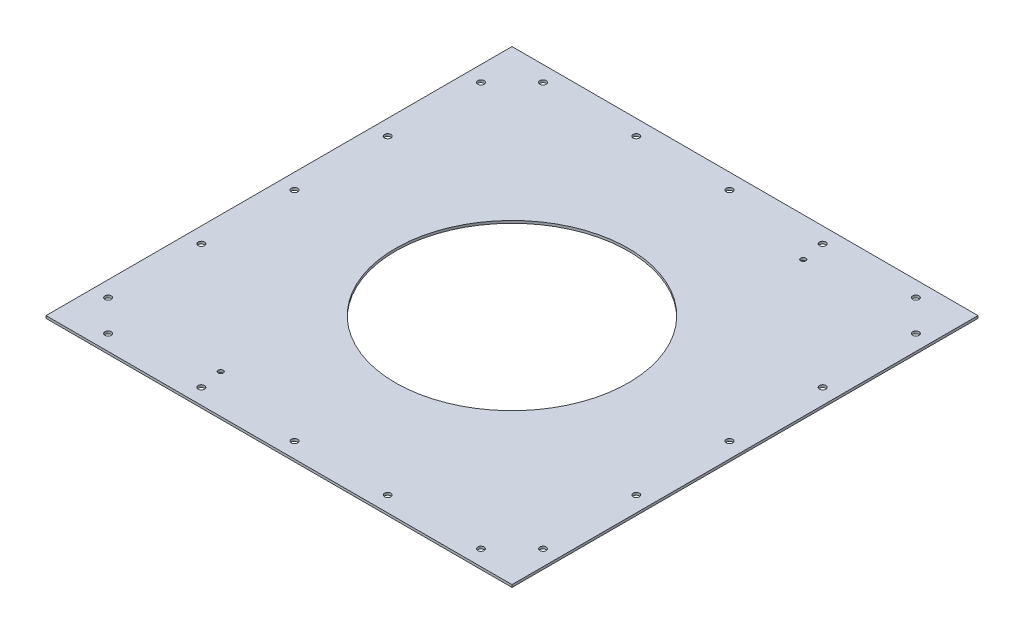
ISO-10303-21;
HEADER;
FILE_DESCRIPTION(('STEP AP214'),'2;1');
FILE_NAME('part.step','',(''),(''),'','','');
FILE_SCHEMA(('AUTOMOTIVE_DESIGN { 1 0 10303 214 1 1 1 1 }'));
ENDSEC;
DATA;
#1=APPLICATION_CONTEXT('core data for automotive mechanical design processes');
#2=APPLICATION_PROTOCOL_DEFINITION('international standard','automotive_design',2000,#1);
#3=PRODUCT_CONTEXT('',#1,'mechanical');
#4=PRODUCT('Part','Part','',(#3));
#5=PRODUCT_RELATED_PRODUCT_CATEGORY('part','',(#4));
#6=PRODUCT_DEFINITION_FORMATION('','',#4);
#7=PRODUCT_DEFINITION_CONTEXT('part definition',#1,'design');
#8=PRODUCT_DEFINITION('design','',#6,#7);
#9=PRODUCT_DEFINITION_SHAPE('','',#8);
#10=(LENGTH_UNIT() NAMED_UNIT(*) SI_UNIT(.MILLI.,.METRE.));
#11=(NAMED_UNIT(*) PLANE_ANGLE_UNIT() SI_UNIT($,.RADIAN.));
#12=(NAMED_UNIT(*) SI_UNIT($,.STERADIAN.) SOLID_ANGLE_UNIT());
#13=UNCERTAINTY_MEASURE_WITH_UNIT(LENGTH_MEASURE(1.E-05),#10,'distance_accuracy_value','');
#14=(GEOMETRIC_REPRESENTATION_CONTEXT(3) GLOBAL_UNCERTAINTY_ASSIGNED_CONTEXT((#13)) GLOBAL_UNIT_ASSIGNED_CONTEXT((#10,
#11,#12)) REPRESENTATION_CONTEXT('',''));
#15=CARTESIAN_POINT('',(0.,0.,0.));
#16=DIRECTION('',(0.,0.,1.));
#17=DIRECTION('',(1.,0.,0.));
#18=AXIS2_PLACEMENT_3D('',#15,#16,#17);
#19=CARTESIAN_POINT('',(300.000000000012,-1.5875,300.));
#20=DIRECTION('',(1.,0.,0.));
#21=DIRECTION('',(0.,0.,-1.));
#22=AXIS2_PLACEMENT_3D('',#19,#20,#21);
#23=PLANE('',#22);
#24=DIRECTION('',(0.,1.,0.));
#25=VECTOR('',#24,1.);
#26=CARTESIAN_POINT('',(300.000000000011,-1.5875,-300.));
#27=LINE('',#26,#25);
#28=CARTESIAN_POINT('',(300.000000000011,-1.5875,-300.));
#29=VERTEX_POINT('',#28);
#30=CARTESIAN_POINT('',(300.000000000011,1.5875,-300.));
#31=VERTEX_POINT('',#30);
#32=EDGE_CURVE('E35',#29,#31,#27,.T.);
#33=ORIENTED_EDGE('',*,*,#32,.T.);
#34=DIRECTION('',(0.,0.,-1.));
#35=VECTOR('',#34,1.);
#36=CARTESIAN_POINT('',(300.000000000012,1.5875,300.));
#37=LINE('',#36,#35);
#38=CARTESIAN_POINT('',(300.000000000012,1.5875,300.));
#39=VERTEX_POINT('',#38);
#40=EDGE_CURVE('E72',#39,#31,#37,.T.);
#41=ORIENTED_EDGE('',*,*,#40,.F.);
#42=DIRECTION('',(0.,1.,0.));
#43=VECTOR('',#42,1.);
#44=CARTESIAN_POINT('',(300.000000000012,-1.5875,300.));
#45=LINE('',#44,#43);
#46=CARTESIAN_POINT('',(300.000000000012,-1.5875,300.));
#47=VERTEX_POINT('',#46);
#48=EDGE_CURVE('E11',#47,#39,#45,.T.);
#49=ORIENTED_EDGE('',*,*,#48,.F.);
#50=DIRECTION('',(0.,0.,-1.));
#51=VECTOR('',#50,1.);
#52=CARTESIAN_POINT('',(300.000000000012,-1.5875,300.));
#53=LINE('',#52,#51);
#54=EDGE_CURVE('E73',#47,#29,#53,.T.);
#55=ORIENTED_EDGE('',*,*,#54,.T.);
#56=EDGE_LOOP('',(#33,#41,#49,#55));
#57=FACE_BOUND('',#56,.T.);
#58=ADVANCED_FACE('F32',(#57),#23,.T.);
#59=CARTESIAN_POINT('',(-300.000000000011,-1.5875,300.));
#60=DIRECTION('',(0.,0.,1.));
#61=DIRECTION('',(1.,0.,0.));
#62=AXIS2_PLACEMENT_3D('',#59,#60,#61);
#63=PLANE('',#62);
#64=ORIENTED_EDGE('',*,*,#48,.T.);
#65=DIRECTION('',(1.,0.,0.));
#66=VECTOR('',#65,1.);
#67=CARTESIAN_POINT('',(-300.000000000011,1.5875,300.));
#68=LINE('',#67,#66);
#69=CARTESIAN_POINT('',(-300.000000000011,1.5875,300.));
#70=VERTEX_POINT('',#69);
#71=EDGE_CURVE('E90',#70,#39,#68,.T.);
#72=ORIENTED_EDGE('',*,*,#71,.F.);
#73=DIRECTION('',(0.,1.,0.));
#74=VECTOR('',#73,1.);
#75=CARTESIAN_POINT('',(-300.000000000011,-1.5875,300.));
#76=LINE('',#75,#74);
#77=CARTESIAN_POINT('',(-300.000000000011,-1.5875,300.));
#78=VERTEX_POINT('',#77);
#79=EDGE_CURVE('E40',#78,#70,#76,.T.);
#80=ORIENTED_EDGE('',*,*,#79,.F.);
#81=DIRECTION('',(1.,0.,0.));
#82=VECTOR('',#81,1.);
#83=CARTESIAN_POINT('',(-300.000000000011,-1.5875,300.));
#84=LINE('',#83,#82);
#85=EDGE_CURVE('E78',#78,#47,#84,.T.);
#86=ORIENTED_EDGE('',*,*,#85,.T.);
#87=EDGE_LOOP('',(#64,#72,#80,#86));
#88=FACE_BOUND('',#87,.T.);
#89=ADVANCED_FACE('F119',(#88),#63,.T.);
#90=CARTESIAN_POINT('',(-300.000000000011,-1.5875,300.));
#91=DIRECTION('',(-1.,0.,0.));
#92=DIRECTION('',(0.,0.,1.));
#93=AXIS2_PLACEMENT_3D('',#90,#91,#92);
#94=PLANE('',#93);
#95=ORIENTED_EDGE('',*,*,#79,.T.);
#96=DIRECTION('',(0.,0.,1.));
#97=VECTOR('',#96,1.);
#98=CARTESIAN_POINT('',(-300.000000000011,1.5875,300.));
#99=LINE('',#98,#97);
#100=CARTESIAN_POINT('',(-300.000000000011,1.5875,-300.));
#101=VERTEX_POINT('',#100);
#102=EDGE_CURVE('E85',#101,#70,#99,.T.);
#103=ORIENTED_EDGE('',*,*,#102,.F.);
#104=DIRECTION('',(0.,1.,0.));
#105=VECTOR('',#104,1.);
#106=CARTESIAN_POINT('',(-300.000000000011,-1.5875,-300.));
#107=LINE('',#106,#105);
#108=CARTESIAN_POINT('',(-300.000000000011,-1.5875,-300.));
#109=VERTEX_POINT('',#108);
#110=EDGE_CURVE('E77',#109,#101,#107,.T.);
#111=ORIENTED_EDGE('',*,*,#110,.F.);
#112=DIRECTION('',(0.,0.,1.));
#113=VECTOR('',#112,1.);
#114=CARTESIAN_POINT('',(-300.000000000011,-1.5875,300.));
#115=LINE('',#114,#113);
#116=EDGE_CURVE('E112',#109,#78,#115,.T.);
#117=ORIENTED_EDGE('',*,*,#116,.T.);
#118=EDGE_LOOP('',(#95,#103,#111,#117));
#119=FACE_BOUND('',#118,.T.);
#120=ADVANCED_FACE('F116',(#119),#94,.T.);
#121=CARTESIAN_POINT('',(-300.000000000011,-1.5875,-300.));
#122=DIRECTION('',(0.,0.,-1.));
#123=DIRECTION('',(-1.,0.,0.));
#124=AXIS2_PLACEMENT_3D('',#121,#122,#123);
#125=PLANE('',#124);
#126=ORIENTED_EDGE('',*,*,#110,.T.);
#127=DIRECTION('',(-1.,0.,0.));
#128=VECTOR('',#127,1.);
#129=CARTESIAN_POINT('',(-300.000000000011,1.5875,-300.));
#130=LINE('',#129,#128);
#131=EDGE_CURVE('E80',#31,#101,#130,.T.);
#132=ORIENTED_EDGE('',*,*,#131,.F.);
#133=ORIENTED_EDGE('',*,*,#32,.F.);
#134=DIRECTION('',(-1.,0.,0.));
#135=VECTOR('',#134,1.);
#136=CARTESIAN_POINT('',(-300.000000000011,-1.5875,-300.));
#137=LINE('',#136,#135);
#138=EDGE_CURVE('E110',#29,#109,#137,.T.);
#139=ORIENTED_EDGE('',*,*,#138,.T.);
#140=EDGE_LOOP('',(#126,#132,#133,#139));
#141=FACE_BOUND('',#140,.T.);
#142=ADVANCED_FACE('F81',(#141),#125,.T.);
#143=CARTESIAN_POINT('',(0.,-1.5875,0.));
#144=DIRECTION('',(0.,-1.,0.));
#145=DIRECTION('',(0.,0.,-1.));
#146=AXIS2_PLACEMENT_3D('',#143,#144,#145);
#147=PLANE('',#146);
#148=CARTESIAN_POINT('',(280.,-1.5875,-119.999999999999));
#149=DIRECTION('',(0.,1.,0.));
#150=DIRECTION('',(-1.,0.,0.));
#151=AXIS2_PLACEMENT_3D('',#148,#149,#150);
#152=CIRCLE('',#151,4.1);
#153=CARTESIAN_POINT('',(275.9,-1.5875,-119.999999999999));
#154=VERTEX_POINT('',#153);
#155=EDGE_CURVE('E394',#154,#154,#152,.T.);
#156=ORIENTED_EDGE('',*,*,#155,.T.);
#157=EDGE_LOOP('',(#156));
#158=FACE_BOUND('',#157,.T.);
#159=CARTESIAN_POINT('',(279.999999999999,-1.5875,-239.999999999999));
#160=DIRECTION('',(0.,1.,0.));
#161=DIRECTION('',(-1.,0.,0.));
#162=AXIS2_PLACEMENT_3D('',#159,#160,#161);
#163=CIRCLE('',#162,4.10000000000001);
#164=CARTESIAN_POINT('',(275.899999999999,-1.5875,-239.999999999999));
#165=VERTEX_POINT('',#164);
#166=EDGE_CURVE('E398',#165,#165,#163,.T.);
#167=ORIENTED_EDGE('',*,*,#166,.T.);
#168=EDGE_LOOP('',(#167));
#169=FACE_BOUND('',#168,.T.);
#170=CARTESIAN_POINT('',(279.999999999998,-1.5875,240.000000000001));
#171=DIRECTION('',(0.,1.,0.));
#172=DIRECTION('',(1.,0.,0.));
#173=AXIS2_PLACEMENT_3D('',#170,#171,#172);
#174=CIRCLE('',#173,4.10000000000001);
#175=CARTESIAN_POINT('',(284.099999999998,-1.5875,240.000000000001));
#176=VERTEX_POINT('',#175);
#177=EDGE_CURVE('E410',#176,#176,#174,.T.);
#178=ORIENTED_EDGE('',*,*,#177,.T.);
#179=EDGE_LOOP('',(#178));
#180=FACE_BOUND('',#179,.T.);
#181=CARTESIAN_POINT('',(279.999999999999,-1.5875,120.000000000001));
#182=DIRECTION('',(0.,1.,0.));
#183=DIRECTION('',(1.,0.,0.));
#184=AXIS2_PLACEMENT_3D('',#181,#182,#183);
#185=CIRCLE('',#184,4.1);
#186=CARTESIAN_POINT('',(284.099999999999,-1.5875,120.000000000001));
#187=VERTEX_POINT('',#186);
#188=EDGE_CURVE('E415',#187,#187,#185,.T.);
#189=ORIENTED_EDGE('',*,*,#188,.T.);
#190=EDGE_LOOP('',(#189));
#191=FACE_BOUND('',#190,.T.);
#192=CARTESIAN_POINT('',(-240.,-1.5875,279.999999999998));
#193=DIRECTION('',(0.,1.,0.));
#194=DIRECTION('',(0.,0.,1.));
#195=AXIS2_PLACEMENT_3D('',#192,#193,#194);
#196=CIRCLE('',#195,4.10000000000001);
#197=CARTESIAN_POINT('',(-240.,-1.5875,284.099999999998));
#198=VERTEX_POINT('',#197);
#199=EDGE_CURVE('E428',#198,#198,#196,.T.);
#200=ORIENTED_EDGE('',*,*,#199,.T.);
#201=EDGE_LOOP('',(#200));
#202=FACE_BOUND('',#201,.T.);
#203=CARTESIAN_POINT('',(240.,-1.5875,279.999999999998));
#204=DIRECTION('',(0.,1.,0.));
#205=DIRECTION('',(0.,0.,-1.));
#206=AXIS2_PLACEMENT_3D('',#203,#204,#205);
#207=CIRCLE('',#206,4.10000000000001);
#208=CARTESIAN_POINT('',(240.,-1.5875,275.899999999998));
#209=VERTEX_POINT('',#208);
#210=EDGE_CURVE('E427',#209,#209,#207,.T.);
#211=ORIENTED_EDGE('',*,*,#210,.T.);
#212=EDGE_LOOP('',(#211));
#213=FACE_BOUND('',#212,.T.);
#214=CARTESIAN_POINT('',(120.,-1.5875,279.999999999999));
#215=DIRECTION('',(0.,1.,0.));
#216=DIRECTION('',(0.,0.,-1.));
#217=AXIS2_PLACEMENT_3D('',#214,#215,#216);
#218=CIRCLE('',#217,4.1);
#219=CARTESIAN_POINT('',(120.,-1.5875,275.899999999999));
#220=VERTEX_POINT('',#219);
#221=EDGE_CURVE('E441',#220,#220,#218,.T.);
#222=ORIENTED_EDGE('',*,*,#221,.T.);
#223=EDGE_LOOP('',(#222));
#224=FACE_BOUND('',#223,.T.);
#225=CARTESIAN_POINT('',(0.,-1.5875,280.));
#226=DIRECTION('',(0.,1.,0.));
#227=DIRECTION('',(0.,0.,-1.));
#228=AXIS2_PLACEMENT_3D('',#225,#226,#227);
#229=CIRCLE('',#228,4.1);
#230=CARTESIAN_POINT('',(0.,-1.5875,275.9));
#231=VERTEX_POINT('',#230);
#232=EDGE_CURVE('E421',#231,#231,#229,.T.);
#233=ORIENTED_EDGE('',*,*,#232,.T.);
#234=EDGE_LOOP('',(#233));
#235=FACE_BOUND('',#234,.T.);
#236=CARTESIAN_POINT('',(-280.000000000001,-1.5875,239.999999999997));
#237=DIRECTION('',(0.,1.,0.));
#238=DIRECTION('',(1.,0.,0.));
#239=AXIS2_PLACEMENT_3D('',#236,#237,#238);
#240=CIRCLE('',#239,4.10000000000001);
#241=CARTESIAN_POINT('',(-275.900000000001,-1.5875,239.999999999997));
#242=VERTEX_POINT('',#241);
#243=EDGE_CURVE('E577',#242,#242,#240,.T.);
#244=ORIENTED_EDGE('',*,*,#243,.T.);
#245=EDGE_LOOP('',(#244));
#246=FACE_BOUND('',#245,.T.);
#247=CARTESIAN_POINT('',(-280.,-1.5875,119.999999999997));
#248=DIRECTION('',(0.,1.,0.));
#249=DIRECTION('',(1.,0.,0.));
#250=AXIS2_PLACEMENT_3D('',#247,#248,#249);
#251=CIRCLE('',#250,4.1);
#252=CARTESIAN_POINT('',(-275.9,-1.5875,119.999999999997));
#253=VERTEX_POINT('',#252);
#254=EDGE_CURVE('E573',#253,#253,#251,.T.);
#255=ORIENTED_EDGE('',*,*,#254,.T.);
#256=EDGE_LOOP('',(#255));
#257=FACE_BOUND('',#256,.T.);
#258=CARTESIAN_POINT('',(-280.,-1.5875,-2.93529361822653E-12));
#259=DIRECTION('',(0.,1.,0.));
#260=DIRECTION('',(1.,0.,0.));
#261=AXIS2_PLACEMENT_3D('',#258,#259,#260);
#262=CIRCLE('',#261,4.1);
#263=CARTESIAN_POINT('',(-275.9,-1.5875,-2.89234839775876E-12));
#264=VERTEX_POINT('',#263);
#265=EDGE_CURVE('E569',#264,#264,#262,.T.);
#266=ORIENTED_EDGE('',*,*,#265,.T.);
#267=EDGE_LOOP('',(#266));
#268=FACE_BOUND('',#267,.T.);
#269=CARTESIAN_POINT('',(-120.,-1.5875,279.999999999999));
#270=DIRECTION('',(0.,1.,0.));
#271=DIRECTION('',(0.,0.,1.));
#272=AXIS2_PLACEMENT_3D('',#269,#270,#271);
#273=CIRCLE('',#272,4.1);
#274=CARTESIAN_POINT('',(-120.,-1.5875,284.099999999999));
#275=VERTEX_POINT('',#274);
#276=EDGE_CURVE('E435',#275,#275,#273,.T.);
#277=ORIENTED_EDGE('',*,*,#276,.T.);
#278=EDGE_LOOP('',(#277));
#279=FACE_BOUND('',#278,.T.);
#280=CARTESIAN_POINT('',(-279.999999999996,-1.5875,-240.000000000003));
#281=DIRECTION('',(0.,1.,0.));
#282=DIRECTION('',(-1.,0.,0.));
#283=AXIS2_PLACEMENT_3D('',#280,#281,#282);
#284=CIRCLE('',#283,4.10000000000001);
#285=CARTESIAN_POINT('',(-284.099999999996,-1.5875,-240.000000000003));
#286=VERTEX_POINT('',#285);
#287=EDGE_CURVE('E565',#286,#286,#284,.T.);
#288=ORIENTED_EDGE('',*,*,#287,.T.);
#289=EDGE_LOOP('',(#288));
#290=FACE_BOUND('',#289,.T.);
#291=CARTESIAN_POINT('',(-279.999999999998,-1.5875,-120.000000000003));
#292=DIRECTION('',(0.,1.,0.));
#293=DIRECTION('',(-1.,0.,0.));
#294=AXIS2_PLACEMENT_3D('',#291,#292,#293);
#295=CIRCLE('',#294,4.1);
#296=CARTESIAN_POINT('',(-284.099999999998,-1.5875,-120.000000000003));
#297=VERTEX_POINT('',#296);
#298=EDGE_CURVE('E406',#297,#297,#295,.T.);
#299=ORIENTED_EDGE('',*,*,#298,.T.);
#300=EDGE_LOOP('',(#299));
#301=FACE_BOUND('',#300,.T.);
#302=CARTESIAN_POINT('',(280.,-1.5875,9.80064068474372E-13));
#303=DIRECTION('',(0.,1.,0.));
#304=DIRECTION('',(-1.,0.,0.));
#305=AXIS2_PLACEMENT_3D('',#302,#303,#304);
#306=CIRCLE('',#305,4.1);
#307=CARTESIAN_POINT('',(275.9,-1.5875,9.65748994985115E-13));
#308=VERTEX_POINT('',#307);
#309=EDGE_CURVE('E450',#308,#308,#306,.T.);
#310=ORIENTED_EDGE('',*,*,#309,.T.);
#311=EDGE_LOOP('',(#310));
#312=FACE_BOUND('',#311,.T.);
#313=CARTESIAN_POINT('',(120.,-1.5875,-279.999999999999));
#314=DIRECTION('',(0.,1.,0.));
#315=DIRECTION('',(0.,0.,-1.));
#316=AXIS2_PLACEMENT_3D('',#313,#314,#315);
#317=CIRCLE('',#316,4.1);
#318=CARTESIAN_POINT('',(120.,-1.5875,-284.099999999999));
#319=VERTEX_POINT('',#318);
#320=EDGE_CURVE('E471',#319,#319,#317,.T.);
#321=ORIENTED_EDGE('',*,*,#320,.T.);
#322=EDGE_LOOP('',(#321));
#323=FACE_BOUND('',#322,.T.);
#324=CARTESIAN_POINT('',(240.,-1.5875,-279.999999999998));
#325=DIRECTION('',(0.,1.,0.));
#326=DIRECTION('',(0.,0.,-1.));
#327=AXIS2_PLACEMENT_3D('',#324,#325,#326);
#328=CIRCLE('',#327,4.10000000000001);
#329=CARTESIAN_POINT('',(240.,-1.5875,-284.099999999998));
#330=VERTEX_POINT('',#329);
#331=EDGE_CURVE('E465',#330,#330,#328,.T.);
#332=ORIENTED_EDGE('',*,*,#331,.T.);
#333=EDGE_LOOP('',(#332));
#334=FACE_BOUND('',#333,.T.);
#335=CARTESIAN_POINT('',(-240.,-1.5875,-279.999999999998));
#336=DIRECTION('',(0.,1.,0.));
#337=DIRECTION('',(0.,0.,1.));
#338=AXIS2_PLACEMENT_3D('',#335,#336,#337);
#339=CIRCLE('',#338,4.10000000000001);
#340=CARTESIAN_POINT('',(-240.,-1.5875,-275.899999999998));
#341=VERTEX_POINT('',#340);
#342=EDGE_CURVE('E458',#341,#341,#339,.T.);
#343=ORIENTED_EDGE('',*,*,#342,.T.);
#344=EDGE_LOOP('',(#343));
#345=FACE_BOUND('',#344,.T.);
#346=CARTESIAN_POINT('',(-120.,-1.5875,-279.999999999999));
#347=DIRECTION('',(0.,1.,0.));
#348=DIRECTION('',(0.,0.,1.));
#349=AXIS2_PLACEMENT_3D('',#346,#347,#348);
#350=CIRCLE('',#349,4.1);
#351=CARTESIAN_POINT('',(-120.,-1.5875,-275.899999999999));
#352=VERTEX_POINT('',#351);
#353=EDGE_CURVE('E457',#352,#352,#350,.T.);
#354=ORIENTED_EDGE('',*,*,#353,.T.);
#355=EDGE_LOOP('',(#354));
#356=FACE_BOUND('',#355,.T.);
#357=CARTESIAN_POINT('',(0.,-1.5875,-280.));
#358=DIRECTION('',(0.,1.,0.));
#359=DIRECTION('',(0.,0.,1.));
#360=AXIS2_PLACEMENT_3D('',#357,#358,#359);
#361=CIRCLE('',#360,4.1);
#362=CARTESIAN_POINT('',(0.,-1.5875,-275.9));
#363=VERTEX_POINT('',#362);
#364=EDGE_CURVE('E480',#363,#363,#361,.T.);
#365=ORIENTED_EDGE('',*,*,#364,.T.);
#366=EDGE_LOOP('',(#365));
#367=FACE_BOUND('',#366,.T.);
#368=CARTESIAN_POINT('',(-2.22044604925031E-13,-1.5875,1.11022302462516E-13));
#369=DIRECTION('',(0.,1.,0.));
#370=DIRECTION('',(0.,0.,1.));
#371=AXIS2_PLACEMENT_3D('',#368,#369,#370);
#372=CIRCLE('',#371,150.);
#373=CARTESIAN_POINT('',(-2.22044604925031E-13,-1.5875,150.));
#374=VERTEX_POINT('',#373);
#375=EDGE_CURVE('E100',#374,#374,#372,.T.);
#376=ORIENTED_EDGE('',*,*,#375,.T.);
#377=EDGE_LOOP('',(#376));
#378=FACE_BOUND('',#377,.T.);
#379=CARTESIAN_POINT('',(-124.999999999998,-1.5875,250.000000000001));
#380=DIRECTION('',(0.,1.,0.));
#381=DIRECTION('',(0.,0.,1.));
#382=AXIS2_PLACEMENT_3D('',#379,#380,#381);
#383=CIRCLE('',#382,3.25000000000001);
#384=CARTESIAN_POINT('',(-124.999999999998,-1.5875,253.250000000001));
#385=VERTEX_POINT('',#384);
#386=EDGE_CURVE('E103',#385,#385,#383,.T.);
#387=ORIENTED_EDGE('',*,*,#386,.T.);
#388=EDGE_LOOP('',(#387));
#389=FACE_BOUND('',#388,.T.);
#390=CARTESIAN_POINT('',(124.999999999998,-1.5875,-250.000000000001));
#391=DIRECTION('',(0.,1.,0.));
#392=DIRECTION('',(0.,0.,1.));
#393=AXIS2_PLACEMENT_3D('',#390,#391,#392);
#394=CIRCLE('',#393,3.25000000000001);
#395=CARTESIAN_POINT('',(124.999999999998,-1.5875,-246.750000000001));
#396=VERTEX_POINT('',#395);
#397=EDGE_CURVE('E106',#396,#396,#394,.T.);
#398=ORIENTED_EDGE('',*,*,#397,.T.);
#399=EDGE_LOOP('',(#398));
#400=FACE_BOUND('',#399,.T.);
#401=ORIENTED_EDGE('',*,*,#54,.F.);
#402=ORIENTED_EDGE('',*,*,#85,.F.);
#403=ORIENTED_EDGE('',*,*,#116,.F.);
#404=ORIENTED_EDGE('',*,*,#138,.F.);
#405=EDGE_LOOP('',(#401,#402,#403,#404));
#406=FACE_BOUND('',#405,.T.);
#407=ADVANCED_FACE('F121',(#158,#169,#180,#191,#202,#213,#224,#235,#246,#257,#268,#279,#290,
#301,#312,#323,#334,#345,#356,#367,#378,#389,#400,#406),#147,.T.);
#408=CARTESIAN_POINT('',(124.999999999998,-1.5875,-250.000000000001));
#409=DIRECTION('',(0.,1.,0.));
#410=DIRECTION('',(0.,0.,1.));
#411=AXIS2_PLACEMENT_3D('',#408,#409,#410);
#412=CYLINDRICAL_SURFACE('',#411,3.25000000000001);
#413=ORIENTED_EDGE('',*,*,#397,.F.);
#414=EDGE_LOOP('',(#413));
#415=FACE_BOUND('',#414,.T.);
#416=CARTESIAN_POINT('',(124.999999999998,1.5875,-250.000000000001));
#417=DIRECTION('',(0.,1.,0.));
#418=DIRECTION('',(0.,0.,1.));
#419=AXIS2_PLACEMENT_3D('',#416,#417,#418);
#420=CIRCLE('',#419,3.25000000000001);
#421=CARTESIAN_POINT('',(124.999999999998,1.5875,-246.750000000001));
#422=VERTEX_POINT('',#421);
#423=EDGE_CURVE('E91',#422,#422,#420,.T.);
#424=ORIENTED_EDGE('',*,*,#423,.T.);
#425=EDGE_LOOP('',(#424));
#426=FACE_BOUND('',#425,.T.);
#427=ADVANCED_FACE('F123',(#415,#426),#412,.F.);
#428=CARTESIAN_POINT('',(-124.999999999998,-1.5875,250.000000000001));
#429=DIRECTION('',(0.,1.,0.));
#430=DIRECTION('',(0.,0.,1.));
#431=AXIS2_PLACEMENT_3D('',#428,#429,#430);
#432=CYLINDRICAL_SURFACE('',#431,3.25000000000001);
#433=ORIENTED_EDGE('',*,*,#386,.F.);
#434=EDGE_LOOP('',(#433));
#435=FACE_BOUND('',#434,.T.);
#436=CARTESIAN_POINT('',(-124.999999999998,1.5875,250.000000000001));
#437=DIRECTION('',(0.,1.,0.));
#438=DIRECTION('',(0.,0.,1.));
#439=AXIS2_PLACEMENT_3D('',#436,#437,#438);
#440=CIRCLE('',#439,3.25000000000001);
#441=CARTESIAN_POINT('',(-124.999999999998,1.5875,253.250000000001));
#442=VERTEX_POINT('',#441);
#443=EDGE_CURVE('E94',#442,#442,#440,.T.);
#444=ORIENTED_EDGE('',*,*,#443,.T.);
#445=EDGE_LOOP('',(#444));
#446=FACE_BOUND('',#445,.T.);
#447=ADVANCED_FACE('F130',(#435,#446),#432,.F.);
#448=CARTESIAN_POINT('',(-2.22044604925031E-13,-1.5875,1.11022302462516E-13));
#449=DIRECTION('',(0.,1.,0.));
#450=DIRECTION('',(0.,0.,1.));
#451=AXIS2_PLACEMENT_3D('',#448,#449,#450);
#452=CYLINDRICAL_SURFACE('',#451,150.);
#453=ORIENTED_EDGE('',*,*,#375,.F.);
#454=EDGE_LOOP('',(#453));
#455=FACE_BOUND('',#454,.T.);
#456=CARTESIAN_POINT('',(-2.22044604925031E-13,1.5875,1.11022302462516E-13));
#457=DIRECTION('',(0.,1.,0.));
#458=DIRECTION('',(0.,0.,1.));
#459=AXIS2_PLACEMENT_3D('',#456,#457,#458);
#460=CIRCLE('',#459,150.);
#461=CARTESIAN_POINT('',(-2.22044604925031E-13,1.5875,150.));
#462=VERTEX_POINT('',#461);
#463=EDGE_CURVE('E483',#462,#462,#460,.T.);
#464=ORIENTED_EDGE('',*,*,#463,.T.);
#465=EDGE_LOOP('',(#464));
#466=FACE_BOUND('',#465,.T.);
#467=ADVANCED_FACE('F166',(#455,#466),#452,.F.);
#468=CARTESIAN_POINT('',(0.,1.5875,0.));
#469=DIRECTION('',(0.,-1.,0.));
#470=DIRECTION('',(0.,0.,-1.));
#471=AXIS2_PLACEMENT_3D('',#468,#469,#470);
#472=PLANE('',#471);
#473=CARTESIAN_POINT('',(280.,1.5875,-119.999999999999));
#474=DIRECTION('',(0.,1.,0.));
#475=DIRECTION('',(-1.,0.,0.));
#476=AXIS2_PLACEMENT_3D('',#473,#474,#475);
#477=CIRCLE('',#476,4.1);
#478=CARTESIAN_POINT('',(275.9,1.5875,-119.999999999999));
#479=VERTEX_POINT('',#478);
#480=EDGE_CURVE('E397',#479,#479,#477,.T.);
#481=ORIENTED_EDGE('',*,*,#480,.F.);
#482=EDGE_LOOP('',(#481));
#483=FACE_BOUND('',#482,.T.);
#484=CARTESIAN_POINT('',(279.999999999999,1.5875,-239.999999999999));
#485=DIRECTION('',(0.,1.,0.));
#486=DIRECTION('',(-1.,0.,0.));
#487=AXIS2_PLACEMENT_3D('',#484,#485,#486);
#488=CIRCLE('',#487,4.10000000000001);
#489=CARTESIAN_POINT('',(275.899999999999,1.5875,-239.999999999999));
#490=VERTEX_POINT('',#489);
#491=EDGE_CURVE('E403',#490,#490,#488,.T.);
#492=ORIENTED_EDGE('',*,*,#491,.F.);
#493=EDGE_LOOP('',(#492));
#494=FACE_BOUND('',#493,.T.);
#495=CARTESIAN_POINT('',(279.999999999998,1.5875,240.000000000001));
#496=DIRECTION('',(0.,1.,0.));
#497=DIRECTION('',(1.,0.,0.));
#498=AXIS2_PLACEMENT_3D('',#495,#496,#497);
#499=CIRCLE('',#498,4.10000000000001);
#500=CARTESIAN_POINT('',(284.099999999998,1.5875,240.000000000001));
#501=VERTEX_POINT('',#500);
#502=EDGE_CURVE('E412',#501,#501,#499,.T.);
#503=ORIENTED_EDGE('',*,*,#502,.F.);
#504=EDGE_LOOP('',(#503));
#505=FACE_BOUND('',#504,.T.);
#506=CARTESIAN_POINT('',(279.999999999999,1.5875,120.000000000001));
#507=DIRECTION('',(0.,1.,0.));
#508=DIRECTION('',(1.,0.,0.));
#509=AXIS2_PLACEMENT_3D('',#506,#507,#508);
#510=CIRCLE('',#509,4.1);
#511=CARTESIAN_POINT('',(284.099999999999,1.5875,120.000000000001));
#512=VERTEX_POINT('',#511);
#513=EDGE_CURVE('E418',#512,#512,#510,.T.);
#514=ORIENTED_EDGE('',*,*,#513,.F.);
#515=EDGE_LOOP('',(#514));
#516=FACE_BOUND('',#515,.T.);
#517=CARTESIAN_POINT('',(-240.,1.5875,279.999999999998));
#518=DIRECTION('',(0.,1.,0.));
#519=DIRECTION('',(0.,0.,1.));
#520=AXIS2_PLACEMENT_3D('',#517,#518,#519);
#521=CIRCLE('',#520,4.10000000000001);
#522=CARTESIAN_POINT('',(-240.,1.5875,284.099999999998));
#523=VERTEX_POINT('',#522);
#524=EDGE_CURVE('E432',#523,#523,#521,.T.);
#525=ORIENTED_EDGE('',*,*,#524,.F.);
#526=EDGE_LOOP('',(#525));
#527=FACE_BOUND('',#526,.T.);
#528=CARTESIAN_POINT('',(240.,1.5875,279.999999999998));
#529=DIRECTION('',(0.,1.,0.));
#530=DIRECTION('',(0.,0.,-1.));
#531=AXIS2_PLACEMENT_3D('',#528,#529,#530);
#532=CIRCLE('',#531,4.10000000000001);
#533=CARTESIAN_POINT('',(240.,1.5875,275.899999999998));
#534=VERTEX_POINT('',#533);
#535=EDGE_CURVE('E424',#534,#534,#532,.T.);
#536=ORIENTED_EDGE('',*,*,#535,.F.);
#537=EDGE_LOOP('',(#536));
#538=FACE_BOUND('',#537,.T.);
#539=CARTESIAN_POINT('',(120.,1.5875,279.999999999999));
#540=DIRECTION('',(0.,1.,0.));
#541=DIRECTION('',(0.,0.,-1.));
#542=AXIS2_PLACEMENT_3D('',#539,#540,#541);
#543=CIRCLE('',#542,4.1);
#544=CARTESIAN_POINT('',(120.,1.5875,275.899999999999));
#545=VERTEX_POINT('',#544);
#546=EDGE_CURVE('E431',#545,#545,#543,.T.);
#547=ORIENTED_EDGE('',*,*,#546,.F.);
#548=EDGE_LOOP('',(#547));
#549=FACE_BOUND('',#548,.T.);
#550=CARTESIAN_POINT('',(0.,1.5875,280.));
#551=DIRECTION('',(0.,1.,0.));
#552=DIRECTION('',(0.,0.,-1.));
#553=AXIS2_PLACEMENT_3D('',#550,#551,#552);
#554=CIRCLE('',#553,4.1);
#555=CARTESIAN_POINT('',(0.,1.5875,275.9));
#556=VERTEX_POINT('',#555);
#557=EDGE_CURVE('E438',#556,#556,#554,.T.);
#558=ORIENTED_EDGE('',*,*,#557,.F.);
#559=EDGE_LOOP('',(#558));
#560=FACE_BOUND('',#559,.T.);
#561=CARTESIAN_POINT('',(-280.000000000001,1.5875,239.999999999997));
#562=DIRECTION('',(0.,1.,0.));
#563=DIRECTION('',(1.,0.,0.));
#564=AXIS2_PLACEMENT_3D('',#561,#562,#563);
#565=CIRCLE('',#564,4.10000000000001);
#566=CARTESIAN_POINT('',(-275.900000000001,1.5875,239.999999999997));
#567=VERTEX_POINT('',#566);
#568=EDGE_CURVE('E542',#567,#567,#565,.T.);
#569=ORIENTED_EDGE('',*,*,#568,.F.);
#570=EDGE_LOOP('',(#569));
#571=FACE_BOUND('',#570,.T.);
#572=CARTESIAN_POINT('',(-280.,1.5875,119.999999999997));
#573=DIRECTION('',(0.,1.,0.));
#574=DIRECTION('',(1.,0.,0.));
#575=AXIS2_PLACEMENT_3D('',#572,#573,#574);
#576=CIRCLE('',#575,4.1);
#577=CARTESIAN_POINT('',(-275.9,1.5875,119.999999999997));
#578=VERTEX_POINT('',#577);
#579=EDGE_CURVE('E546',#578,#578,#576,.T.);
#580=ORIENTED_EDGE('',*,*,#579,.F.);
#581=EDGE_LOOP('',(#580));
#582=FACE_BOUND('',#581,.T.);
#583=CARTESIAN_POINT('',(-280.,1.5875,-2.93529361822653E-12));
#584=DIRECTION('',(0.,1.,0.));
#585=DIRECTION('',(1.,0.,0.));
#586=AXIS2_PLACEMENT_3D('',#583,#584,#585);
#587=CIRCLE('',#586,4.1);
#588=CARTESIAN_POINT('',(-275.9,1.5875,-2.89234839775876E-12));
#589=VERTEX_POINT('',#588);
#590=EDGE_CURVE('E550',#589,#589,#587,.T.);
#591=ORIENTED_EDGE('',*,*,#590,.F.);
#592=EDGE_LOOP('',(#591));
#593=FACE_BOUND('',#592,.T.);
#594=CARTESIAN_POINT('',(-120.,1.5875,279.999999999999));
#595=DIRECTION('',(0.,1.,0.));
#596=DIRECTION('',(0.,0.,1.));
#597=AXIS2_PLACEMENT_3D('',#594,#595,#596);
#598=CIRCLE('',#597,4.1);
#599=CARTESIAN_POINT('',(-120.,1.5875,284.099999999999));
#600=VERTEX_POINT('',#599);
#601=EDGE_CURVE('E554',#600,#600,#598,.T.);
#602=ORIENTED_EDGE('',*,*,#601,.F.);
#603=EDGE_LOOP('',(#602));
#604=FACE_BOUND('',#603,.T.);
#605=CARTESIAN_POINT('',(-279.999999999996,1.5875,-240.000000000003));
#606=DIRECTION('',(0.,1.,0.));
#607=DIRECTION('',(-1.,0.,0.));
#608=AXIS2_PLACEMENT_3D('',#605,#606,#607);
#609=CIRCLE('',#608,4.10000000000001);
#610=CARTESIAN_POINT('',(-284.099999999996,1.5875,-240.000000000003));
#611=VERTEX_POINT('',#610);
#612=EDGE_CURVE('E558',#611,#611,#609,.T.);
#613=ORIENTED_EDGE('',*,*,#612,.F.);
#614=EDGE_LOOP('',(#613));
#615=FACE_BOUND('',#614,.T.);
#616=CARTESIAN_POINT('',(-279.999999999998,1.5875,-120.000000000003));
#617=DIRECTION('',(0.,1.,0.));
#618=DIRECTION('',(-1.,0.,0.));
#619=AXIS2_PLACEMENT_3D('',#616,#617,#618);
#620=CIRCLE('',#619,4.1);
#621=CARTESIAN_POINT('',(-284.099999999998,1.5875,-120.000000000003));
#622=VERTEX_POINT('',#621);
#623=EDGE_CURVE('E561',#622,#622,#620,.T.);
#624=ORIENTED_EDGE('',*,*,#623,.F.);
#625=EDGE_LOOP('',(#624));
#626=FACE_BOUND('',#625,.T.);
#627=CARTESIAN_POINT('',(280.,1.5875,9.80064068474372E-13));
#628=DIRECTION('',(0.,1.,0.));
#629=DIRECTION('',(-1.,0.,0.));
#630=AXIS2_PLACEMENT_3D('',#627,#628,#629);
#631=CIRCLE('',#630,4.1);
#632=CARTESIAN_POINT('',(275.9,1.5875,9.65748994985115E-13));
#633=VERTEX_POINT('',#632);
#634=EDGE_CURVE('E400',#633,#633,#631,.T.);
#635=ORIENTED_EDGE('',*,*,#634,.F.);
#636=EDGE_LOOP('',(#635));
#637=FACE_BOUND('',#636,.T.);
#638=CARTESIAN_POINT('',(120.,1.5875,-279.999999999999));
#639=DIRECTION('',(0.,1.,0.));
#640=DIRECTION('',(0.,0.,-1.));
#641=AXIS2_PLACEMENT_3D('',#638,#639,#640);
#642=CIRCLE('',#641,4.1);
#643=CARTESIAN_POINT('',(120.,1.5875,-284.099999999999));
#644=VERTEX_POINT('',#643);
#645=EDGE_CURVE('E453',#644,#644,#642,.T.);
#646=ORIENTED_EDGE('',*,*,#645,.F.);
#647=EDGE_LOOP('',(#646));
#648=FACE_BOUND('',#647,.T.);
#649=CARTESIAN_POINT('',(240.,1.5875,-279.999999999998));
#650=DIRECTION('',(0.,1.,0.));
#651=DIRECTION('',(0.,0.,-1.));
#652=AXIS2_PLACEMENT_3D('',#649,#650,#651);
#653=CIRCLE('',#652,4.10000000000001);
#654=CARTESIAN_POINT('',(240.,1.5875,-284.099999999998));
#655=VERTEX_POINT('',#654);
#656=EDGE_CURVE('E468',#655,#655,#653,.T.);
#657=ORIENTED_EDGE('',*,*,#656,.F.);
#658=EDGE_LOOP('',(#657));
#659=FACE_BOUND('',#658,.T.);
#660=CARTESIAN_POINT('',(-240.,1.5875,-279.999999999998));
#661=DIRECTION('',(0.,1.,0.));
#662=DIRECTION('',(0.,0.,1.));
#663=AXIS2_PLACEMENT_3D('',#660,#661,#662);
#664=CIRCLE('',#663,4.10000000000001);
#665=CARTESIAN_POINT('',(-240.,1.5875,-275.899999999998));
#666=VERTEX_POINT('',#665);
#667=EDGE_CURVE('E462',#666,#666,#664,.T.);
#668=ORIENTED_EDGE('',*,*,#667,.F.);
#669=EDGE_LOOP('',(#668));
#670=FACE_BOUND('',#669,.T.);
#671=CARTESIAN_POINT('',(-120.,1.5875,-279.999999999999));
#672=DIRECTION('',(0.,1.,0.));
#673=DIRECTION('',(0.,0.,1.));
#674=AXIS2_PLACEMENT_3D('',#671,#672,#673);
#675=CIRCLE('',#674,4.1);
#676=CARTESIAN_POINT('',(-120.,1.5875,-275.899999999999));
#677=VERTEX_POINT('',#676);
#678=EDGE_CURVE('E454',#677,#677,#675,.T.);
#679=ORIENTED_EDGE('',*,*,#678,.F.);
#680=EDGE_LOOP('',(#679));
#681=FACE_BOUND('',#680,.T.);
#682=CARTESIAN_POINT('',(0.,1.5875,-280.));
#683=DIRECTION('',(0.,1.,0.));
#684=DIRECTION('',(0.,0.,1.));
#685=AXIS2_PLACEMENT_3D('',#682,#683,#684);
#686=CIRCLE('',#685,4.1);
#687=CARTESIAN_POINT('',(0.,1.5875,-275.9));
#688=VERTEX_POINT('',#687);
#689=EDGE_CURVE('E461',#688,#688,#686,.T.);
#690=ORIENTED_EDGE('',*,*,#689,.F.);
#691=EDGE_LOOP('',(#690));
#692=FACE_BOUND('',#691,.T.);
#693=ORIENTED_EDGE('',*,*,#40,.T.);
#694=ORIENTED_EDGE('',*,*,#131,.T.);
#695=ORIENTED_EDGE('',*,*,#102,.T.);
#696=ORIENTED_EDGE('',*,*,#71,.T.);
#697=EDGE_LOOP('',(#693,#694,#695,#696));
#698=FACE_BOUND('',#697,.T.);
#699=ORIENTED_EDGE('',*,*,#423,.F.);
#700=EDGE_LOOP('',(#699));
#701=FACE_BOUND('',#700,.T.);
#702=ORIENTED_EDGE('',*,*,#443,.F.);
#703=EDGE_LOOP('',(#702));
#704=FACE_BOUND('',#703,.T.);
#705=ORIENTED_EDGE('',*,*,#463,.F.);
#706=EDGE_LOOP('',(#705));
#707=FACE_BOUND('',#706,.T.);
#708=ADVANCED_FACE('F88',(#483,#494,#505,#516,#527,#538,#549,#560,#571,#582,#593,#604,#615,#626,
#637,#648,#659,#670,#681,#692,#698,#701,#704,#707),#472,.F.);
#709=CARTESIAN_POINT('',(0.,-1.5875,-280.));
#710=DIRECTION('',(0.,1.,0.));
#711=DIRECTION('',(0.,0.,1.));
#712=AXIS2_PLACEMENT_3D('',#709,#710,#711);
#713=CYLINDRICAL_SURFACE('',#712,4.1);
#714=ORIENTED_EDGE('',*,*,#364,.F.);
#715=EDGE_LOOP('',(#714));
#716=FACE_BOUND('',#715,.T.);
#717=ORIENTED_EDGE('',*,*,#689,.T.);
#718=EDGE_LOOP('',(#717));
#719=FACE_BOUND('',#718,.T.);
#720=ADVANCED_FACE('F183',(#716,#719),#713,.F.);
#721=CARTESIAN_POINT('',(-120.,-1.5875,-279.999999999999));
#722=DIRECTION('',(0.,1.,0.));
#723=DIRECTION('',(0.,0.,1.));
#724=AXIS2_PLACEMENT_3D('',#721,#722,#723);
#725=CYLINDRICAL_SURFACE('',#724,4.1);
#726=ORIENTED_EDGE('',*,*,#353,.F.);
#727=EDGE_LOOP('',(#726));
#728=FACE_BOUND('',#727,.T.);
#729=ORIENTED_EDGE('',*,*,#678,.T.);
#730=EDGE_LOOP('',(#729));
#731=FACE_BOUND('',#730,.T.);
#732=ADVANCED_FACE('F188',(#728,#731),#725,.F.);
#733=CARTESIAN_POINT('',(-240.,-1.5875,-279.999999999998));
#734=DIRECTION('',(0.,1.,0.));
#735=DIRECTION('',(0.,0.,1.));
#736=AXIS2_PLACEMENT_3D('',#733,#734,#735);
#737=CYLINDRICAL_SURFACE('',#736,4.10000000000001);
#738=ORIENTED_EDGE('',*,*,#342,.F.);
#739=EDGE_LOOP('',(#738));
#740=FACE_BOUND('',#739,.T.);
#741=ORIENTED_EDGE('',*,*,#667,.T.);
#742=EDGE_LOOP('',(#741));
#743=FACE_BOUND('',#742,.T.);
#744=ADVANCED_FACE('F198',(#740,#743),#737,.F.);
#745=CARTESIAN_POINT('',(240.,-1.5875,-279.999999999998));
#746=DIRECTION('',(0.,1.,0.));
#747=DIRECTION('',(0.,0.,1.));
#748=AXIS2_PLACEMENT_3D('',#745,#746,#747);
#749=CYLINDRICAL_SURFACE('',#748,4.10000000000001);
#750=ORIENTED_EDGE('',*,*,#331,.F.);
#751=EDGE_LOOP('',(#750));
#752=FACE_BOUND('',#751,.T.);
#753=ORIENTED_EDGE('',*,*,#656,.T.);
#754=EDGE_LOOP('',(#753));
#755=FACE_BOUND('',#754,.T.);
#756=ADVANCED_FACE('F208',(#752,#755),#749,.F.);
#757=CARTESIAN_POINT('',(120.,-1.5875,-279.999999999999));
#758=DIRECTION('',(0.,1.,0.));
#759=DIRECTION('',(0.,0.,1.));
#760=AXIS2_PLACEMENT_3D('',#757,#758,#759);
#761=CYLINDRICAL_SURFACE('',#760,4.1);
#762=ORIENTED_EDGE('',*,*,#320,.F.);
#763=EDGE_LOOP('',(#762));
#764=FACE_BOUND('',#763,.T.);
#765=ORIENTED_EDGE('',*,*,#645,.T.);
#766=EDGE_LOOP('',(#765));
#767=FACE_BOUND('',#766,.T.);
#768=ADVANCED_FACE('F218',(#764,#767),#761,.F.);
#769=CARTESIAN_POINT('',(280.,-1.5875,9.80064068474372E-13));
#770=DIRECTION('',(0.,1.,0.));
#771=DIRECTION('',(0.,0.,1.));
#772=AXIS2_PLACEMENT_3D('',#769,#770,#771);
#773=CYLINDRICAL_SURFACE('',#772,4.1);
#774=ORIENTED_EDGE('',*,*,#309,.F.);
#775=EDGE_LOOP('',(#774));
#776=FACE_BOUND('',#775,.T.);
#777=ORIENTED_EDGE('',*,*,#634,.T.);
#778=EDGE_LOOP('',(#777));
#779=FACE_BOUND('',#778,.T.);
#780=ADVANCED_FACE('F227',(#776,#779),#773,.F.);
#781=CARTESIAN_POINT('',(-279.999999999998,-1.5875,-120.000000000003));
#782=DIRECTION('',(0.,1.,0.));
#783=DIRECTION('',(0.,0.,1.));
#784=AXIS2_PLACEMENT_3D('',#781,#782,#783);
#785=CYLINDRICAL_SURFACE('',#784,4.1);
#786=ORIENTED_EDGE('',*,*,#298,.F.);
#787=EDGE_LOOP('',(#786));
#788=FACE_BOUND('',#787,.T.);
#789=ORIENTED_EDGE('',*,*,#623,.T.);
#790=EDGE_LOOP('',(#789));
#791=FACE_BOUND('',#790,.T.);
#792=ADVANCED_FACE('F248',(#788,#791),#785,.F.);
#793=CARTESIAN_POINT('',(-279.999999999996,-1.5875,-240.000000000003));
#794=DIRECTION('',(0.,1.,0.));
#795=DIRECTION('',(0.,0.,1.));
#796=AXIS2_PLACEMENT_3D('',#793,#794,#795);
#797=CYLINDRICAL_SURFACE('',#796,4.10000000000001);
#798=ORIENTED_EDGE('',*,*,#287,.F.);
#799=EDGE_LOOP('',(#798));
#800=FACE_BOUND('',#799,.T.);
#801=ORIENTED_EDGE('',*,*,#612,.T.);
#802=EDGE_LOOP('',(#801));
#803=FACE_BOUND('',#802,.T.);
#804=ADVANCED_FACE('F258',(#800,#803),#797,.F.);
#805=CARTESIAN_POINT('',(-120.,-1.5875,279.999999999999));
#806=DIRECTION('',(0.,1.,0.));
#807=DIRECTION('',(0.,0.,1.));
#808=AXIS2_PLACEMENT_3D('',#805,#806,#807);
#809=CYLINDRICAL_SURFACE('',#808,4.1);
#810=ORIENTED_EDGE('',*,*,#276,.F.);
#811=EDGE_LOOP('',(#810));
#812=FACE_BOUND('',#811,.T.);
#813=ORIENTED_EDGE('',*,*,#601,.T.);
#814=EDGE_LOOP('',(#813));
#815=FACE_BOUND('',#814,.T.);
#816=ADVANCED_FACE('F268',(#812,#815),#809,.F.);
#817=CARTESIAN_POINT('',(-280.,-1.5875,-2.93529361822653E-12));
#818=DIRECTION('',(0.,1.,0.));
#819=DIRECTION('',(0.,0.,1.));
#820=AXIS2_PLACEMENT_3D('',#817,#818,#819);
#821=CYLINDRICAL_SURFACE('',#820,4.1);
#822=ORIENTED_EDGE('',*,*,#265,.F.);
#823=EDGE_LOOP('',(#822));
#824=FACE_BOUND('',#823,.T.);
#825=ORIENTED_EDGE('',*,*,#590,.T.);
#826=EDGE_LOOP('',(#825));
#827=FACE_BOUND('',#826,.T.);
#828=ADVANCED_FACE('F278',(#824,#827),#821,.F.);
#829=CARTESIAN_POINT('',(-280.,-1.5875,119.999999999997));
#830=DIRECTION('',(0.,1.,0.));
#831=DIRECTION('',(0.,0.,1.));
#832=AXIS2_PLACEMENT_3D('',#829,#830,#831);
#833=CYLINDRICAL_SURFACE('',#832,4.1);
#834=ORIENTED_EDGE('',*,*,#254,.F.);
#835=EDGE_LOOP('',(#834));
#836=FACE_BOUND('',#835,.T.);
#837=ORIENTED_EDGE('',*,*,#579,.T.);
#838=EDGE_LOOP('',(#837));
#839=FACE_BOUND('',#838,.T.);
#840=ADVANCED_FACE('F288',(#836,#839),#833,.F.);
#841=CARTESIAN_POINT('',(-280.000000000001,-1.5875,239.999999999997));
#842=DIRECTION('',(0.,1.,0.));
#843=DIRECTION('',(0.,0.,1.));
#844=AXIS2_PLACEMENT_3D('',#841,#842,#843);
#845=CYLINDRICAL_SURFACE('',#844,4.10000000000001);
#846=ORIENTED_EDGE('',*,*,#243,.F.);
#847=EDGE_LOOP('',(#846));
#848=FACE_BOUND('',#847,.T.);
#849=ORIENTED_EDGE('',*,*,#568,.T.);
#850=EDGE_LOOP('',(#849));
#851=FACE_BOUND('',#850,.T.);
#852=ADVANCED_FACE('F298',(#848,#851),#845,.F.);
#853=CARTESIAN_POINT('',(0.,-1.5875,280.));
#854=DIRECTION('',(0.,1.,0.));
#855=DIRECTION('',(0.,0.,1.));
#856=AXIS2_PLACEMENT_3D('',#853,#854,#855);
#857=CYLINDRICAL_SURFACE('',#856,4.1);
#858=ORIENTED_EDGE('',*,*,#232,.F.);
#859=EDGE_LOOP('',(#858));
#860=FACE_BOUND('',#859,.T.);
#861=ORIENTED_EDGE('',*,*,#557,.T.);
#862=EDGE_LOOP('',(#861));
#863=FACE_BOUND('',#862,.T.);
#864=ADVANCED_FACE('F308',(#860,#863),#857,.F.);
#865=CARTESIAN_POINT('',(120.,-1.5875,279.999999999999));
#866=DIRECTION('',(0.,1.,0.));
#867=DIRECTION('',(0.,0.,1.));
#868=AXIS2_PLACEMENT_3D('',#865,#866,#867);
#869=CYLINDRICAL_SURFACE('',#868,4.1);
#870=ORIENTED_EDGE('',*,*,#221,.F.);
#871=EDGE_LOOP('',(#870));
#872=FACE_BOUND('',#871,.T.);
#873=ORIENTED_EDGE('',*,*,#546,.T.);
#874=EDGE_LOOP('',(#873));
#875=FACE_BOUND('',#874,.T.);
#876=ADVANCED_FACE('F318',(#872,#875),#869,.F.);
#877=CARTESIAN_POINT('',(240.,-1.5875,279.999999999998));
#878=DIRECTION('',(0.,1.,0.));
#879=DIRECTION('',(0.,0.,1.));
#880=AXIS2_PLACEMENT_3D('',#877,#878,#879);
#881=CYLINDRICAL_SURFACE('',#880,4.10000000000001);
#882=ORIENTED_EDGE('',*,*,#210,.F.);
#883=EDGE_LOOP('',(#882));
#884=FACE_BOUND('',#883,.T.);
#885=ORIENTED_EDGE('',*,*,#535,.T.);
#886=EDGE_LOOP('',(#885));
#887=FACE_BOUND('',#886,.T.);
#888=ADVANCED_FACE('F328',(#884,#887),#881,.F.);
#889=CARTESIAN_POINT('',(-240.,-1.5875,279.999999999998));
#890=DIRECTION('',(0.,1.,0.));
#891=DIRECTION('',(0.,0.,1.));
#892=AXIS2_PLACEMENT_3D('',#889,#890,#891);
#893=CYLINDRICAL_SURFACE('',#892,4.10000000000001);
#894=ORIENTED_EDGE('',*,*,#199,.F.);
#895=EDGE_LOOP('',(#894));
#896=FACE_BOUND('',#895,.T.);
#897=ORIENTED_EDGE('',*,*,#524,.T.);
#898=EDGE_LOOP('',(#897));
#899=FACE_BOUND('',#898,.T.);
#900=ADVANCED_FACE('F338',(#896,#899),#893,.F.);
#901=CARTESIAN_POINT('',(279.999999999999,-1.5875,120.000000000001));
#902=DIRECTION('',(0.,1.,0.));
#903=DIRECTION('',(0.,0.,1.));
#904=AXIS2_PLACEMENT_3D('',#901,#902,#903);
#905=CYLINDRICAL_SURFACE('',#904,4.1);
#906=ORIENTED_EDGE('',*,*,#188,.F.);
#907=EDGE_LOOP('',(#906));
#908=FACE_BOUND('',#907,.T.);
#909=ORIENTED_EDGE('',*,*,#513,.T.);
#910=EDGE_LOOP('',(#909));
#911=FACE_BOUND('',#910,.T.);
#912=ADVANCED_FACE('F348',(#908,#911),#905,.F.);
#913=CARTESIAN_POINT('',(279.999999999998,-1.5875,240.000000000001));
#914=DIRECTION('',(0.,1.,0.));
#915=DIRECTION('',(0.,0.,1.));
#916=AXIS2_PLACEMENT_3D('',#913,#914,#915);
#917=CYLINDRICAL_SURFACE('',#916,4.10000000000001);
#918=ORIENTED_EDGE('',*,*,#177,.F.);
#919=EDGE_LOOP('',(#918));
#920=FACE_BOUND('',#919,.T.);
#921=ORIENTED_EDGE('',*,*,#502,.T.);
#922=EDGE_LOOP('',(#921));
#923=FACE_BOUND('',#922,.T.);
#924=ADVANCED_FACE('F358',(#920,#923),#917,.F.);
#925=CARTESIAN_POINT('',(279.999999999999,-1.5875,-239.999999999999));
#926=DIRECTION('',(0.,1.,0.));
#927=DIRECTION('',(0.,0.,1.));
#928=AXIS2_PLACEMENT_3D('',#925,#926,#927);
#929=CYLINDRICAL_SURFACE('',#928,4.10000000000001);
#930=ORIENTED_EDGE('',*,*,#166,.F.);
#931=EDGE_LOOP('',(#930));
#932=FACE_BOUND('',#931,.T.);
#933=ORIENTED_EDGE('',*,*,#491,.T.);
#934=EDGE_LOOP('',(#933));
#935=FACE_BOUND('',#934,.T.);
#936=ADVANCED_FACE('F368',(#932,#935),#929,.F.);
#937=CARTESIAN_POINT('',(280.,-1.5875,-119.999999999999));
#938=DIRECTION('',(0.,1.,0.));
#939=DIRECTION('',(0.,0.,1.));
#940=AXIS2_PLACEMENT_3D('',#937,#938,#939);
#941=CYLINDRICAL_SURFACE('',#940,4.1);
#942=ORIENTED_EDGE('',*,*,#155,.F.);
#943=EDGE_LOOP('',(#942));
#944=FACE_BOUND('',#943,.T.);
#945=ORIENTED_EDGE('',*,*,#480,.T.);
#946=EDGE_LOOP('',(#945));
#947=FACE_BOUND('',#946,.T.);
#948=ADVANCED_FACE('F378',(#944,#947),#941,.F.);
#949=CLOSED_SHELL('',(#58,#89,#120,#142,#407,#427,#447,#467,#708,#720,#732,#744,#756,#768,#780,
#792,#804,#816,#828,#840,#852,#864,#876,#888,#900,#912,#924,#936,#948));
#950=MANIFOLD_SOLID_BREP('B2',#949);
#951=ADVANCED_BREP_SHAPE_REPRESENTATION('',(#18,#950),#14);
#952=SHAPE_DEFINITION_REPRESENTATION(#9,#951);
ENDSEC;
END-ISO-10303-21;
